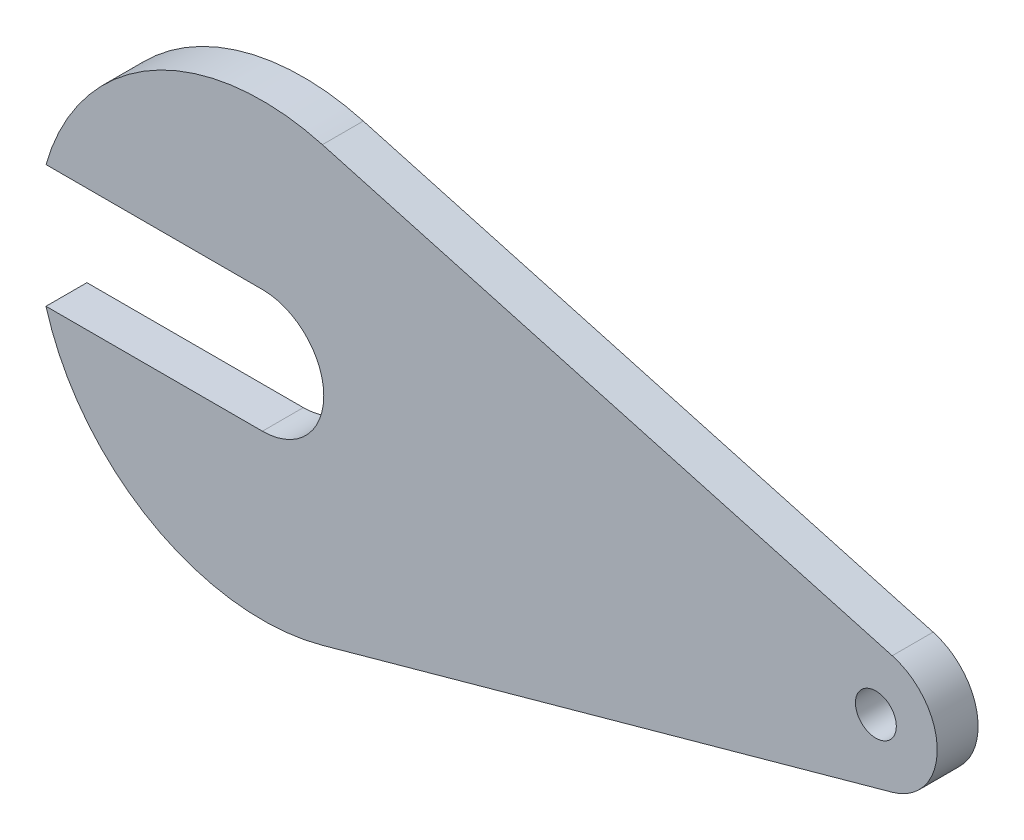
ISO-10303-21;
HEADER;
FILE_DESCRIPTION(('STEP AP214'),'2;1');
FILE_NAME('part.step','',(''),(''),'','','');
FILE_SCHEMA(('AUTOMOTIVE_DESIGN { 1 0 10303 214 1 1 1 1 }'));
ENDSEC;
DATA;
#1=APPLICATION_CONTEXT('core data for automotive mechanical design processes');
#2=APPLICATION_PROTOCOL_DEFINITION('international standard','automotive_design',2000,#1);
#3=PRODUCT_CONTEXT('',#1,'mechanical');
#4=PRODUCT('Part','Part','',(#3));
#5=PRODUCT_RELATED_PRODUCT_CATEGORY('part','',(#4));
#6=PRODUCT_DEFINITION_FORMATION('','',#4);
#7=PRODUCT_DEFINITION_CONTEXT('part definition',#1,'design');
#8=PRODUCT_DEFINITION('design','',#6,#7);
#9=PRODUCT_DEFINITION_SHAPE('','',#8);
#10=(LENGTH_UNIT() NAMED_UNIT(*) SI_UNIT(.MILLI.,.METRE.));
#11=(NAMED_UNIT(*) PLANE_ANGLE_UNIT() SI_UNIT($,.RADIAN.));
#12=(NAMED_UNIT(*) SI_UNIT($,.STERADIAN.) SOLID_ANGLE_UNIT());
#13=UNCERTAINTY_MEASURE_WITH_UNIT(LENGTH_MEASURE(1.E-05),#10,'distance_accuracy_value','');
#14=(GEOMETRIC_REPRESENTATION_CONTEXT(3) GLOBAL_UNCERTAINTY_ASSIGNED_CONTEXT((#13)) GLOBAL_UNIT_ASSIGNED_CONTEXT((#10,
#11,#12)) REPRESENTATION_CONTEXT('',''));
#15=CARTESIAN_POINT('',(0.,0.,0.));
#16=DIRECTION('',(0.,0.,1.));
#17=DIRECTION('',(1.,0.,0.));
#18=AXIS2_PLACEMENT_3D('',#15,#16,#17);
#19=CARTESIAN_POINT('',(215.747807913493,241.952019993179,3.));
#20=DIRECTION('',(0.,0.,1.));
#21=DIRECTION('',(1.,0.,0.));
#22=AXIS2_PLACEMENT_3D('',#19,#20,#21);
#23=PLANE('',#22);
#24=CARTESIAN_POINT('',(215.747807913493,241.952019993179,3.));
#25=DIRECTION('',(0.,0.,1.));
#26=DIRECTION('',(1.,0.,0.));
#27=AXIS2_PLACEMENT_3D('',#24,#25,#26);
#28=CIRCLE('',#27,16.5);
#29=CARTESIAN_POINT('',(199.8733000471,237.4520199932,3.));
#30=VERTEX_POINT('',#29);
#31=CARTESIAN_POINT('',(220.1478079135,226.0495044689,3.));
#32=VERTEX_POINT('',#31);
#33=EDGE_CURVE('E145',#30,#32,#28,.T.);
#34=ORIENTED_EDGE('',*,*,#33,.T.);
#35=DIRECTION('',(0.963788819653046,0.266666666667935,0.));
#36=VECTOR('',#35,1.);
#37=CARTESIAN_POINT('',(220.1478079135,226.0495044689,3.));
#38=LINE('',#37,#36);
#39=CARTESIAN_POINT('',(261.9478079135,237.6149703048,3.));
#40=VERTEX_POINT('',#39);
#41=EDGE_CURVE('E93',#32,#40,#38,.T.);
#42=ORIENTED_EDGE('',*,*,#41,.T.);
#43=CARTESIAN_POINT('',(260.747807913535,241.95201999325,3.));
#44=DIRECTION('',(0.,0.,1.));
#45=DIRECTION('',(1.,0.,0.));
#46=AXIS2_PLACEMENT_3D('',#43,#44,#45);
#47=CIRCLE('',#46,4.5);
#48=CARTESIAN_POINT('',(261.9478079135,246.2890696817,3.));
#49=VERTEX_POINT('',#48);
#50=EDGE_CURVE('E160',#40,#49,#47,.T.);
#51=ORIENTED_EDGE('',*,*,#50,.T.);
#52=DIRECTION('',(-0.963788819653639,0.266666666665793,0.));
#53=VECTOR('',#52,1.);
#54=CARTESIAN_POINT('',(261.9478079135,246.2890696817,3.));
#55=LINE('',#54,#53);
#56=CARTESIAN_POINT('',(220.147807913496,257.854535517486,3.));
#57=VERTEX_POINT('',#56);
#58=EDGE_CURVE('E173',#49,#57,#55,.T.);
#59=ORIENTED_EDGE('',*,*,#58,.T.);
#60=CARTESIAN_POINT('',(215.747807913493,241.952019993179,3.));
#61=DIRECTION('',(0.,0.,1.));
#62=DIRECTION('',(1.,0.,0.));
#63=AXIS2_PLACEMENT_3D('',#60,#61,#62);
#64=CIRCLE('',#63,16.5000000000257);
#65=CARTESIAN_POINT('',(199.8733000471,246.4520199932,3.));
#66=VERTEX_POINT('',#65);
#67=EDGE_CURVE('E112',#57,#66,#64,.T.);
#68=ORIENTED_EDGE('',*,*,#67,.T.);
#69=DIRECTION('',(1.,0.,0.));
#70=VECTOR('',#69,1.);
#71=CARTESIAN_POINT('',(215.7478079135,246.4520199932,3.));
#72=LINE('',#71,#70);
#73=CARTESIAN_POINT('',(215.7478079135,246.452019993179,3.));
#74=VERTEX_POINT('',#73);
#75=EDGE_CURVE('E106',#66,#74,#72,.T.);
#76=ORIENTED_EDGE('',*,*,#75,.T.);
#77=CARTESIAN_POINT('',(215.747807913493,241.952019993179,3.));
#78=DIRECTION('',(0.,0.,-1.));
#79=DIRECTION('',(1.,0.,0.));
#80=AXIS2_PLACEMENT_3D('',#77,#78,#79);
#81=CIRCLE('',#80,4.49999999999999);
#82=CARTESIAN_POINT('',(215.7478079135,237.4520199932,3.));
#83=VERTEX_POINT('',#82);
#84=EDGE_CURVE('E110',#74,#83,#81,.T.);
#85=ORIENTED_EDGE('',*,*,#84,.T.);
#86=DIRECTION('',(-1.,0.,0.));
#87=VECTOR('',#86,1.);
#88=CARTESIAN_POINT('',(215.7478079135,237.4520199932,3.));
#89=LINE('',#88,#87);
#90=EDGE_CURVE('E50',#83,#30,#89,.T.);
#91=ORIENTED_EDGE('',*,*,#90,.T.);
#92=EDGE_LOOP('',(#34,#42,#51,#59,#68,#76,#85,#91));
#93=FACE_BOUND('',#92,.T.);
#94=CARTESIAN_POINT('',(260.747807913535,241.95201999325,3.));
#95=DIRECTION('',(0.,0.,1.));
#96=DIRECTION('',(1.,0.,0.));
#97=AXIS2_PLACEMENT_3D('',#94,#95,#96);
#98=CIRCLE('',#97,1.49999999996497);
#99=CARTESIAN_POINT('',(262.2478079135,241.95201999325,3.));
#100=VERTEX_POINT('',#99);
#101=EDGE_CURVE('E134',#100,#100,#98,.T.);
#102=ORIENTED_EDGE('',*,*,#101,.F.);
#103=EDGE_LOOP('',(#102));
#104=FACE_BOUND('',#103,.T.);
#105=ADVANCED_FACE('F33',(#93,#104),#23,.T.);
#106=CARTESIAN_POINT('',(215.747807913493,241.952019993179,0.));
#107=DIRECTION('',(0.,0.,1.));
#108=DIRECTION('',(1.,0.,0.));
#109=AXIS2_PLACEMENT_3D('',#106,#107,#108);
#110=PLANE('',#109);
#111=CARTESIAN_POINT('',(215.747807913493,241.952019993179,0.));
#112=DIRECTION('',(0.,0.,1.));
#113=DIRECTION('',(1.,0.,0.));
#114=AXIS2_PLACEMENT_3D('',#111,#112,#113);
#115=CIRCLE('',#114,16.5);
#116=CARTESIAN_POINT('',(199.8733000471,237.4520199932,0.));
#117=VERTEX_POINT('',#116);
#118=CARTESIAN_POINT('',(220.1478079135,226.0495044689,0.));
#119=VERTEX_POINT('',#118);
#120=EDGE_CURVE('E130',#117,#119,#115,.T.);
#121=ORIENTED_EDGE('',*,*,#120,.F.);
#122=DIRECTION('',(-1.,0.,0.));
#123=VECTOR('',#122,1.);
#124=CARTESIAN_POINT('',(215.7478079135,237.4520199932,0.));
#125=LINE('',#124,#123);
#126=CARTESIAN_POINT('',(215.7478079135,237.4520199932,0.));
#127=VERTEX_POINT('',#126);
#128=EDGE_CURVE('E85',#127,#117,#125,.T.);
#129=ORIENTED_EDGE('',*,*,#128,.F.);
#130=CARTESIAN_POINT('',(215.747807913493,241.952019993179,0.));
#131=DIRECTION('',(0.,0.,-1.));
#132=DIRECTION('',(1.,0.,0.));
#133=AXIS2_PLACEMENT_3D('',#130,#131,#132);
#134=CIRCLE('',#133,4.49999999999999);
#135=CARTESIAN_POINT('',(215.7478079135,246.452019993179,0.));
#136=VERTEX_POINT('',#135);
#137=EDGE_CURVE('E79',#136,#127,#134,.T.);
#138=ORIENTED_EDGE('',*,*,#137,.F.);
#139=DIRECTION('',(1.,0.,0.));
#140=VECTOR('',#139,1.);
#141=CARTESIAN_POINT('',(215.7478079135,246.4520199932,0.));
#142=LINE('',#141,#140);
#143=CARTESIAN_POINT('',(199.8733000471,246.4520199932,0.));
#144=VERTEX_POINT('',#143);
#145=EDGE_CURVE('E120',#144,#136,#142,.T.);
#146=ORIENTED_EDGE('',*,*,#145,.F.);
#147=CARTESIAN_POINT('',(215.747807913493,241.952019993179,0.));
#148=DIRECTION('',(0.,0.,1.));
#149=DIRECTION('',(1.,0.,0.));
#150=AXIS2_PLACEMENT_3D('',#147,#148,#149);
#151=CIRCLE('',#150,16.5000000000257);
#152=CARTESIAN_POINT('',(220.147807913496,257.854535517486,0.));
#153=VERTEX_POINT('',#152);
#154=EDGE_CURVE('E140',#153,#144,#151,.T.);
#155=ORIENTED_EDGE('',*,*,#154,.F.);
#156=DIRECTION('',(-0.963788819653639,0.266666666665793,0.));
#157=VECTOR('',#156,1.);
#158=CARTESIAN_POINT('',(261.9478079135,246.2890696817,0.));
#159=LINE('',#158,#157);
#160=CARTESIAN_POINT('',(261.9478079135,246.2890696817,0.));
#161=VERTEX_POINT('',#160);
#162=EDGE_CURVE('E138',#161,#153,#159,.T.);
#163=ORIENTED_EDGE('',*,*,#162,.F.);
#164=CARTESIAN_POINT('',(260.747807913535,241.95201999325,0.));
#165=DIRECTION('',(0.,0.,1.));
#166=DIRECTION('',(1.,0.,0.));
#167=AXIS2_PLACEMENT_3D('',#164,#165,#166);
#168=CIRCLE('',#167,4.5);
#169=CARTESIAN_POINT('',(261.9478079135,237.6149703048,0.));
#170=VERTEX_POINT('',#169);
#171=EDGE_CURVE('E136',#170,#161,#168,.T.);
#172=ORIENTED_EDGE('',*,*,#171,.F.);
#173=DIRECTION('',(0.963788819653046,0.266666666667935,0.));
#174=VECTOR('',#173,1.);
#175=CARTESIAN_POINT('',(220.1478079135,226.0495044689,0.));
#176=LINE('',#175,#174);
#177=EDGE_CURVE('E133',#119,#170,#176,.T.);
#178=ORIENTED_EDGE('',*,*,#177,.F.);
#179=EDGE_LOOP('',(#121,#129,#138,#146,#155,#163,#172,#178));
#180=FACE_BOUND('',#179,.T.);
#181=CARTESIAN_POINT('',(260.747807913535,241.95201999325,0.));
#182=DIRECTION('',(0.,0.,1.));
#183=DIRECTION('',(1.,0.,0.));
#184=AXIS2_PLACEMENT_3D('',#181,#182,#183);
#185=CIRCLE('',#184,1.49999999996497);
#186=CARTESIAN_POINT('',(262.2478079135,241.95201999325,0.));
#187=VERTEX_POINT('',#186);
#188=EDGE_CURVE('E179',#187,#187,#185,.T.);
#189=ORIENTED_EDGE('',*,*,#188,.T.);
#190=EDGE_LOOP('',(#189));
#191=FACE_BOUND('',#190,.T.);
#192=ADVANCED_FACE('F164',(#180,#191),#110,.F.);
#193=CARTESIAN_POINT('',(215.747807913493,241.952019993179,3.));
#194=DIRECTION('',(0.,0.,-1.));
#195=DIRECTION('',(-1.,0.,0.));
#196=AXIS2_PLACEMENT_3D('',#193,#194,#195);
#197=CYLINDRICAL_SURFACE('',#196,16.5);
#198=ORIENTED_EDGE('',*,*,#120,.T.);
#199=DIRECTION('',(0.,0.,-1.));
#200=VECTOR('',#199,1.);
#201=CARTESIAN_POINT('',(220.1478079135,226.0495044689,3.));
#202=LINE('',#201,#200);
#203=EDGE_CURVE('E11',#32,#119,#202,.T.);
#204=ORIENTED_EDGE('',*,*,#203,.F.);
#205=ORIENTED_EDGE('',*,*,#33,.F.);
#206=DIRECTION('',(0.,0.,-1.));
#207=VECTOR('',#206,1.);
#208=CARTESIAN_POINT('',(199.8733000471,237.4520199932,3.));
#209=LINE('',#208,#207);
#210=EDGE_CURVE('E126',#30,#117,#209,.T.);
#211=ORIENTED_EDGE('',*,*,#210,.T.);
#212=EDGE_LOOP('',(#198,#204,#205,#211));
#213=FACE_BOUND('',#212,.T.);
#214=ADVANCED_FACE('F35',(#213),#197,.T.);
#215=CARTESIAN_POINT('',(220.1478079135,226.0495044689,3.));
#216=DIRECTION('',(-0.266666666667935,0.963788819653046,0.));
#217=DIRECTION('',(-0.963788819653046,-0.266666666667935,0.));
#218=AXIS2_PLACEMENT_3D('',#215,#216,#217);
#219=PLANE('',#218);
#220=ORIENTED_EDGE('',*,*,#177,.T.);
#221=DIRECTION('',(0.,0.,-1.));
#222=VECTOR('',#221,1.);
#223=CARTESIAN_POINT('',(261.9478079135,237.6149703048,3.));
#224=LINE('',#223,#222);
#225=EDGE_CURVE('E42',#40,#170,#224,.T.);
#226=ORIENTED_EDGE('',*,*,#225,.F.);
#227=ORIENTED_EDGE('',*,*,#41,.F.);
#228=ORIENTED_EDGE('',*,*,#203,.T.);
#229=EDGE_LOOP('',(#220,#226,#227,#228));
#230=FACE_BOUND('',#229,.T.);
#231=ADVANCED_FACE('F207',(#230),#219,.F.);
#232=CARTESIAN_POINT('',(260.747807913535,241.95201999325,3.));
#233=DIRECTION('',(0.,0.,-1.));
#234=DIRECTION('',(-1.,0.,0.));
#235=AXIS2_PLACEMENT_3D('',#232,#233,#234);
#236=CYLINDRICAL_SURFACE('',#235,4.5);
#237=ORIENTED_EDGE('',*,*,#171,.T.);
#238=DIRECTION('',(0.,0.,-1.));
#239=VECTOR('',#238,1.);
#240=CARTESIAN_POINT('',(261.9478079135,246.2890696817,3.));
#241=LINE('',#240,#239);
#242=EDGE_CURVE('E152',#49,#161,#241,.T.);
#243=ORIENTED_EDGE('',*,*,#242,.F.);
#244=ORIENTED_EDGE('',*,*,#50,.F.);
#245=ORIENTED_EDGE('',*,*,#225,.T.);
#246=EDGE_LOOP('',(#237,#243,#244,#245));
#247=FACE_BOUND('',#246,.T.);
#248=ADVANCED_FACE('F158',(#247),#236,.T.);
#249=CARTESIAN_POINT('',(261.9478079135,246.2890696817,3.));
#250=DIRECTION('',(-0.266666666665793,-0.963788819653639,0.));
#251=DIRECTION('',(0.963788819653639,-0.266666666665793,0.));
#252=AXIS2_PLACEMENT_3D('',#249,#250,#251);
#253=PLANE('',#252);
#254=ORIENTED_EDGE('',*,*,#162,.T.);
#255=DIRECTION('',(0.,0.,-1.));
#256=VECTOR('',#255,1.);
#257=CARTESIAN_POINT('',(220.147807913496,257.854535517486,3.));
#258=LINE('',#257,#256);
#259=EDGE_CURVE('E149',#57,#153,#258,.T.);
#260=ORIENTED_EDGE('',*,*,#259,.F.);
#261=ORIENTED_EDGE('',*,*,#58,.F.);
#262=ORIENTED_EDGE('',*,*,#242,.T.);
#263=EDGE_LOOP('',(#254,#260,#261,#262));
#264=FACE_BOUND('',#263,.T.);
#265=ADVANCED_FACE('F169',(#264),#253,.F.);
#266=CARTESIAN_POINT('',(215.747807913493,241.952019993179,3.));
#267=DIRECTION('',(0.,0.,-1.));
#268=DIRECTION('',(-1.,0.,0.));
#269=AXIS2_PLACEMENT_3D('',#266,#267,#268);
#270=CYLINDRICAL_SURFACE('',#269,16.5000000000257);
#271=ORIENTED_EDGE('',*,*,#154,.T.);
#272=DIRECTION('',(0.,0.,-1.));
#273=VECTOR('',#272,1.);
#274=CARTESIAN_POINT('',(199.8733000471,246.4520199932,3.));
#275=LINE('',#274,#273);
#276=EDGE_CURVE('E121',#66,#144,#275,.T.);
#277=ORIENTED_EDGE('',*,*,#276,.F.);
#278=ORIENTED_EDGE('',*,*,#67,.F.);
#279=ORIENTED_EDGE('',*,*,#259,.T.);
#280=EDGE_LOOP('',(#271,#277,#278,#279));
#281=FACE_BOUND('',#280,.T.);
#282=ADVANCED_FACE('F172',(#281),#270,.T.);
#283=CARTESIAN_POINT('',(215.7478079135,246.4520199932,3.));
#284=DIRECTION('',(0.,1.,0.));
#285=DIRECTION('',(0.,0.,1.));
#286=AXIS2_PLACEMENT_3D('',#283,#284,#285);
#287=PLANE('',#286);
#288=ORIENTED_EDGE('',*,*,#145,.T.);
#289=DIRECTION('',(0.,0.,-1.));
#290=VECTOR('',#289,1.);
#291=CARTESIAN_POINT('',(215.7478079135,246.452019993179,3.));
#292=LINE('',#291,#290);
#293=EDGE_CURVE('E117',#74,#136,#292,.T.);
#294=ORIENTED_EDGE('',*,*,#293,.F.);
#295=ORIENTED_EDGE('',*,*,#75,.F.);
#296=ORIENTED_EDGE('',*,*,#276,.T.);
#297=EDGE_LOOP('',(#288,#294,#295,#296));
#298=FACE_BOUND('',#297,.T.);
#299=ADVANCED_FACE('F118',(#298),#287,.F.);
#300=CARTESIAN_POINT('',(215.747807913493,241.952019993179,3.));
#301=DIRECTION('',(0.,0.,-1.));
#302=DIRECTION('',(-1.,0.,0.));
#303=AXIS2_PLACEMENT_3D('',#300,#301,#302);
#304=CYLINDRICAL_SURFACE('',#303,4.49999999999999);
#305=ORIENTED_EDGE('',*,*,#137,.T.);
#306=DIRECTION('',(0.,0.,-1.));
#307=VECTOR('',#306,1.);
#308=CARTESIAN_POINT('',(215.7478079135,237.4520199932,3.));
#309=LINE('',#308,#307);
#310=EDGE_CURVE('E122',#83,#127,#309,.T.);
#311=ORIENTED_EDGE('',*,*,#310,.F.);
#312=ORIENTED_EDGE('',*,*,#84,.F.);
#313=ORIENTED_EDGE('',*,*,#293,.T.);
#314=EDGE_LOOP('',(#305,#311,#312,#313));
#315=FACE_BOUND('',#314,.T.);
#316=ADVANCED_FACE('F124',(#315),#304,.F.);
#317=CARTESIAN_POINT('',(215.7478079135,237.4520199932,3.));
#318=DIRECTION('',(0.,-1.,0.));
#319=DIRECTION('',(0.,0.,-1.));
#320=AXIS2_PLACEMENT_3D('',#317,#318,#319);
#321=PLANE('',#320);
#322=ORIENTED_EDGE('',*,*,#128,.T.);
#323=ORIENTED_EDGE('',*,*,#210,.F.);
#324=ORIENTED_EDGE('',*,*,#90,.F.);
#325=ORIENTED_EDGE('',*,*,#310,.T.);
#326=EDGE_LOOP('',(#322,#323,#324,#325));
#327=FACE_BOUND('',#326,.T.);
#328=ADVANCED_FACE('F195',(#327),#321,.F.);
#329=CARTESIAN_POINT('',(260.747807913535,241.95201999325,3.));
#330=DIRECTION('',(0.,0.,-1.));
#331=DIRECTION('',(-1.,0.,0.));
#332=AXIS2_PLACEMENT_3D('',#329,#330,#331);
#333=CYLINDRICAL_SURFACE('',#332,1.49999999996497);
#334=ORIENTED_EDGE('',*,*,#101,.T.);
#335=EDGE_LOOP('',(#334));
#336=FACE_BOUND('',#335,.T.);
#337=ORIENTED_EDGE('',*,*,#188,.F.);
#338=EDGE_LOOP('',(#337));
#339=FACE_BOUND('',#338,.T.);
#340=ADVANCED_FACE('F185',(#336,#339),#333,.F.);
#341=CLOSED_SHELL('',(#105,#192,#214,#231,#248,#265,#282,#299,#316,#328,#340));
#342=MANIFOLD_SOLID_BREP('B2',#341);
#343=ADVANCED_BREP_SHAPE_REPRESENTATION('',(#18,#342),#14);
#344=SHAPE_DEFINITION_REPRESENTATION(#9,#343);
ENDSEC;
END-ISO-10303-21;
